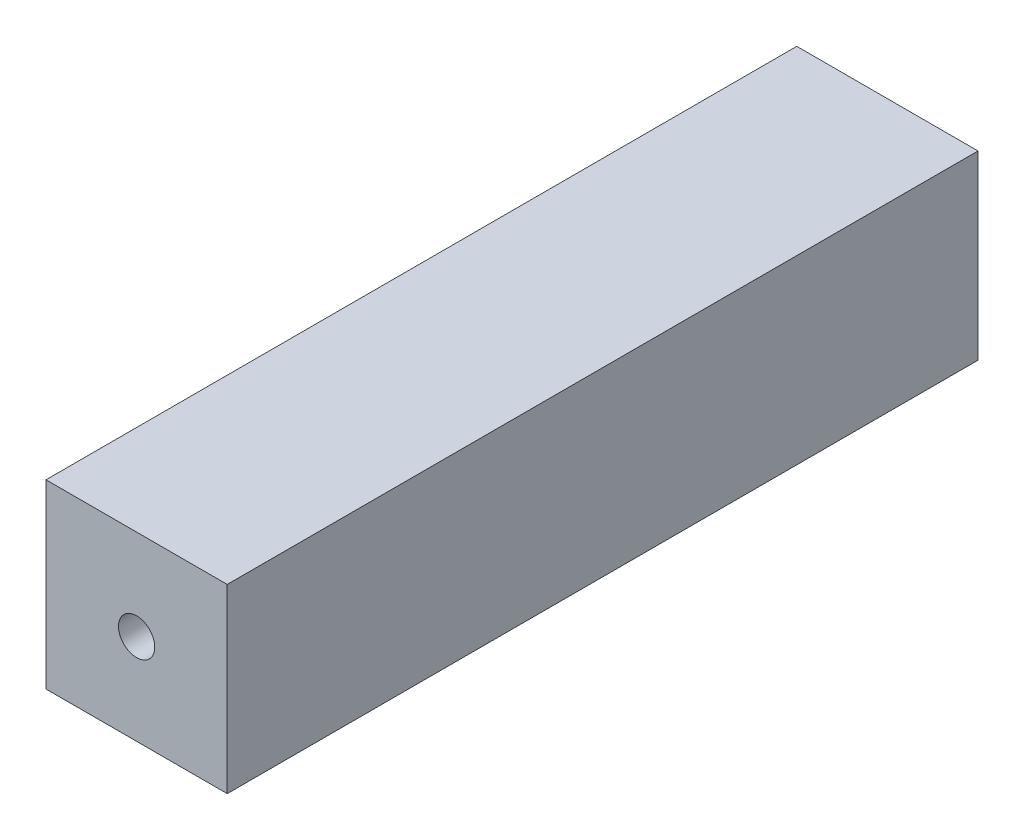
ISO-10303-21;
HEADER;
FILE_DESCRIPTION(('STEP AP214'),'2;1');
FILE_NAME('part.step','',(''),(''),'','','');
FILE_SCHEMA(('AUTOMOTIVE_DESIGN { 1 0 10303 214 1 1 1 1 }'));
ENDSEC;
DATA;
#1=APPLICATION_CONTEXT('core data for automotive mechanical design processes');
#2=APPLICATION_PROTOCOL_DEFINITION('international standard','automotive_design',2000,#1);
#3=PRODUCT_CONTEXT('',#1,'mechanical');
#4=PRODUCT('Part','Part','',(#3));
#5=PRODUCT_RELATED_PRODUCT_CATEGORY('part','',(#4));
#6=PRODUCT_DEFINITION_FORMATION('','',#4);
#7=PRODUCT_DEFINITION_CONTEXT('part definition',#1,'design');
#8=PRODUCT_DEFINITION('design','',#6,#7);
#9=PRODUCT_DEFINITION_SHAPE('','',#8);
#10=(LENGTH_UNIT() NAMED_UNIT(*) SI_UNIT(.MILLI.,.METRE.));
#11=(NAMED_UNIT(*) PLANE_ANGLE_UNIT() SI_UNIT($,.RADIAN.));
#12=(NAMED_UNIT(*) SI_UNIT($,.STERADIAN.) SOLID_ANGLE_UNIT());
#13=UNCERTAINTY_MEASURE_WITH_UNIT(LENGTH_MEASURE(1.E-05),#10,'distance_accuracy_value','');
#14=(GEOMETRIC_REPRESENTATION_CONTEXT(3) GLOBAL_UNCERTAINTY_ASSIGNED_CONTEXT((#13)) GLOBAL_UNIT_ASSIGNED_CONTEXT((#10,
#11,#12)) REPRESENTATION_CONTEXT('',''));
#15=CARTESIAN_POINT('',(0.,0.,0.));
#16=DIRECTION('',(0.,0.,1.));
#17=DIRECTION('',(1.,0.,0.));
#18=AXIS2_PLACEMENT_3D('',#15,#16,#17);
#19=CARTESIAN_POINT('',(8.,-92.,193.6));
#20=DIRECTION('',(0.,0.,1.));
#21=DIRECTION('',(1.,0.,0.));
#22=AXIS2_PLACEMENT_3D('',#19,#20,#21);
#23=PLANE('',#22);
#24=CARTESIAN_POINT('',(8.,-92.,193.6));
#25=DIRECTION('',(0.,0.,1.));
#26=DIRECTION('',(1.,0.,0.));
#27=AXIS2_PLACEMENT_3D('',#24,#25,#26);
#28=CIRCLE('',#27,1.4);
#29=CARTESIAN_POINT('',(9.4,-92.,193.6));
#30=VERTEX_POINT('',#29);
#31=EDGE_CURVE('E9',#30,#30,#28,.T.);
#32=ORIENTED_EDGE('',*,*,#31,.F.);
#33=EDGE_LOOP('',(#32));
#34=FACE_BOUND('',#33,.T.);
#35=ADVANCED_FACE('F14',(#34),#23,.F.);
#36=CARTESIAN_POINT('',(8.,-92.,231.4));
#37=DIRECTION('',(0.,0.,1.));
#38=DIRECTION('',(1.,0.,0.));
#39=AXIS2_PLACEMENT_3D('',#36,#37,#38);
#40=PLANE('',#39);
#41=CARTESIAN_POINT('',(8.,-92.,231.4));
#42=DIRECTION('',(0.,0.,1.));
#43=DIRECTION('',(1.,0.,0.));
#44=AXIS2_PLACEMENT_3D('',#41,#42,#43);
#45=CIRCLE('',#44,1.4);
#46=CARTESIAN_POINT('',(9.4,-92.,231.4));
#47=VERTEX_POINT('',#46);
#48=EDGE_CURVE('E89',#47,#47,#45,.T.);
#49=ORIENTED_EDGE('',*,*,#48,.T.);
#50=EDGE_LOOP('',(#49));
#51=FACE_BOUND('',#50,.T.);
#52=ADVANCED_FACE('F204',(#51),#40,.T.);
#53=CARTESIAN_POINT('',(8.,-92.,181.4));
#54=DIRECTION('',(0.,0.,1.));
#55=DIRECTION('',(1.,0.,0.));
#56=AXIS2_PLACEMENT_3D('',#53,#54,#55);
#57=CYLINDRICAL_SURFACE('',#56,1.4);
#58=CARTESIAN_POINT('',(8.,-92.,181.5));
#59=DIRECTION('',(0.,0.,1.));
#60=DIRECTION('',(1.,0.,0.));
#61=AXIS2_PLACEMENT_3D('',#58,#59,#60);
#62=CIRCLE('',#61,1.4);
#63=CARTESIAN_POINT('',(9.4,-92.,181.5));
#64=VERTEX_POINT('',#63);
#65=EDGE_CURVE('E91',#64,#64,#62,.T.);
#66=ORIENTED_EDGE('',*,*,#65,.F.);
#67=DIRECTION('',(0.,0.,1.));
#68=VECTOR('',#67,1.);
#69=CARTESIAN_POINT('',(9.4,-92.,181.4));
#70=LINE('',#69,#68);
#71=EDGE_CURVE('E25',#64,#30,#70,.T.);
#72=ORIENTED_EDGE('',*,*,#71,.T.);
#73=ORIENTED_EDGE('',*,*,#31,.T.);
#74=ORIENTED_EDGE('',*,*,#71,.F.);
#75=EDGE_LOOP('',(#66,#72,#73,#74));
#76=FACE_BOUND('',#75,.T.);
#77=ADVANCED_FACE('F199',(#76),#57,.F.);
#78=CARTESIAN_POINT('',(8.,-92.,231.4));
#79=DIRECTION('',(0.,0.,1.));
#80=DIRECTION('',(1.,0.,0.));
#81=AXIS2_PLACEMENT_3D('',#78,#79,#80);
#82=CYLINDRICAL_SURFACE('',#81,1.4);
#83=DIRECTION('',(0.,0.,1.));
#84=VECTOR('',#83,1.);
#85=CARTESIAN_POINT('',(9.4,-92.,231.4));
#86=LINE('',#85,#84);
#87=CARTESIAN_POINT('',(9.4,-92.,239.5));
#88=VERTEX_POINT('',#87);
#89=EDGE_CURVE('E85',#47,#88,#86,.T.);
#90=ORIENTED_EDGE('',*,*,#89,.F.);
#91=ORIENTED_EDGE('',*,*,#48,.F.);
#92=ORIENTED_EDGE('',*,*,#89,.T.);
#93=CARTESIAN_POINT('',(8.,-92.,239.5));
#94=DIRECTION('',(0.,0.,1.));
#95=DIRECTION('',(1.,0.,0.));
#96=AXIS2_PLACEMENT_3D('',#93,#94,#95);
#97=CIRCLE('',#96,1.4);
#98=EDGE_CURVE('E88',#88,#88,#97,.T.);
#99=ORIENTED_EDGE('',*,*,#98,.T.);
#100=EDGE_LOOP('',(#90,#91,#92,#99));
#101=FACE_BOUND('',#100,.T.);
#102=ADVANCED_FACE('F86',(#101),#82,.F.);
#103=CARTESIAN_POINT('',(15.,-99.,181.5));
#104=DIRECTION('',(1.,0.,0.));
#105=DIRECTION('',(0.,1.,0.));
#106=AXIS2_PLACEMENT_3D('',#103,#104,#105);
#107=PLANE('',#106);
#108=DIRECTION('',(0.,0.,1.));
#109=VECTOR('',#108,1.);
#110=CARTESIAN_POINT('',(15.,-99.,181.5));
#111=LINE('',#110,#109);
#112=CARTESIAN_POINT('',(15.,-99.,181.5));
#113=VERTEX_POINT('',#112);
#114=CARTESIAN_POINT('',(15.,-99.,239.5));
#115=VERTEX_POINT('',#114);
#116=EDGE_CURVE('E107',#113,#115,#111,.T.);
#117=ORIENTED_EDGE('',*,*,#116,.F.);
#118=DIRECTION('',(0.,1.,0.));
#119=VECTOR('',#118,1.);
#120=CARTESIAN_POINT('',(15.,-99.,181.5));
#121=LINE('',#120,#119);
#122=CARTESIAN_POINT('',(15.,-85.,181.5));
#123=VERTEX_POINT('',#122);
#124=EDGE_CURVE('E75',#113,#123,#121,.T.);
#125=ORIENTED_EDGE('',*,*,#124,.T.);
#126=DIRECTION('',(0.,0.,1.));
#127=VECTOR('',#126,1.);
#128=CARTESIAN_POINT('',(15.,-85.,181.5));
#129=LINE('',#128,#127);
#130=CARTESIAN_POINT('',(15.,-85.,239.5));
#131=VERTEX_POINT('',#130);
#132=EDGE_CURVE('E128',#123,#131,#129,.T.);
#133=ORIENTED_EDGE('',*,*,#132,.T.);
#134=DIRECTION('',(0.,1.,0.));
#135=VECTOR('',#134,1.);
#136=CARTESIAN_POINT('',(15.,-99.,239.5));
#137=LINE('',#136,#135);
#138=EDGE_CURVE('E18',#115,#131,#137,.T.);
#139=ORIENTED_EDGE('',*,*,#138,.F.);
#140=EDGE_LOOP('',(#117,#125,#133,#139));
#141=FACE_BOUND('',#140,.T.);
#142=ADVANCED_FACE('F16',(#141),#107,.T.);
#143=CARTESIAN_POINT('',(1.,-99.,181.5));
#144=DIRECTION('',(0.,0.,1.));
#145=DIRECTION('',(1.,0.,0.));
#146=AXIS2_PLACEMENT_3D('',#143,#144,#145);
#147=PLANE('',#146);
#148=ORIENTED_EDGE('',*,*,#65,.T.);
#149=EDGE_LOOP('',(#148));
#150=FACE_BOUND('',#149,.T.);
#151=DIRECTION('',(1.,0.,0.));
#152=VECTOR('',#151,1.);
#153=CARTESIAN_POINT('',(1.,-85.,181.5));
#154=LINE('',#153,#152);
#155=CARTESIAN_POINT('',(1.,-85.,181.5));
#156=VERTEX_POINT('',#155);
#157=EDGE_CURVE('E134',#156,#123,#154,.T.);
#158=ORIENTED_EDGE('',*,*,#157,.T.);
#159=ORIENTED_EDGE('',*,*,#124,.F.);
#160=DIRECTION('',(1.,0.,0.));
#161=VECTOR('',#160,1.);
#162=CARTESIAN_POINT('',(1.,-99.,181.5));
#163=LINE('',#162,#161);
#164=CARTESIAN_POINT('',(1.,-99.,181.5));
#165=VERTEX_POINT('',#164);
#166=EDGE_CURVE('E106',#165,#113,#163,.T.);
#167=ORIENTED_EDGE('',*,*,#166,.F.);
#168=DIRECTION('',(0.,1.,0.));
#169=VECTOR('',#168,1.);
#170=CARTESIAN_POINT('',(1.,-99.,181.5));
#171=LINE('',#170,#169);
#172=EDGE_CURVE('E125',#165,#156,#171,.T.);
#173=ORIENTED_EDGE('',*,*,#172,.T.);
#174=EDGE_LOOP('',(#158,#159,#167,#173));
#175=FACE_BOUND('',#174,.T.);
#176=ADVANCED_FACE('F172',(#150,#175),#147,.F.);
#177=CARTESIAN_POINT('',(1.,-85.,181.5));
#178=DIRECTION('',(0.,1.,0.));
#179=DIRECTION('',(1.,0.,0.));
#180=AXIS2_PLACEMENT_3D('',#177,#178,#179);
#181=PLANE('',#180);
#182=ORIENTED_EDGE('',*,*,#157,.F.);
#183=DIRECTION('',(0.,0.,1.));
#184=VECTOR('',#183,1.);
#185=CARTESIAN_POINT('',(1.,-85.,181.5));
#186=LINE('',#185,#184);
#187=CARTESIAN_POINT('',(1.,-85.,239.5));
#188=VERTEX_POINT('',#187);
#189=EDGE_CURVE('E102',#156,#188,#186,.T.);
#190=ORIENTED_EDGE('',*,*,#189,.T.);
#191=DIRECTION('',(1.,0.,0.));
#192=VECTOR('',#191,1.);
#193=CARTESIAN_POINT('',(1.,-85.,239.5));
#194=LINE('',#193,#192);
#195=EDGE_CURVE('E143',#188,#131,#194,.T.);
#196=ORIENTED_EDGE('',*,*,#195,.T.);
#197=ORIENTED_EDGE('',*,*,#132,.F.);
#198=EDGE_LOOP('',(#182,#190,#196,#197));
#199=FACE_BOUND('',#198,.T.);
#200=ADVANCED_FACE('F144',(#199),#181,.T.);
#201=CARTESIAN_POINT('',(1.,-99.,239.5));
#202=DIRECTION('',(0.,0.,1.));
#203=DIRECTION('',(1.,0.,0.));
#204=AXIS2_PLACEMENT_3D('',#201,#202,#203);
#205=PLANE('',#204);
#206=ORIENTED_EDGE('',*,*,#98,.F.);
#207=EDGE_LOOP('',(#206));
#208=FACE_BOUND('',#207,.T.);
#209=DIRECTION('',(0.,1.,0.));
#210=VECTOR('',#209,1.);
#211=CARTESIAN_POINT('',(1.,-99.,239.5));
#212=LINE('',#211,#210);
#213=CARTESIAN_POINT('',(1.,-99.,239.5));
#214=VERTEX_POINT('',#213);
#215=EDGE_CURVE('E130',#214,#188,#212,.T.);
#216=ORIENTED_EDGE('',*,*,#215,.F.);
#217=DIRECTION('',(1.,0.,0.));
#218=VECTOR('',#217,1.);
#219=CARTESIAN_POINT('',(1.,-99.,239.5));
#220=LINE('',#219,#218);
#221=EDGE_CURVE('E104',#214,#115,#220,.T.);
#222=ORIENTED_EDGE('',*,*,#221,.T.);
#223=ORIENTED_EDGE('',*,*,#138,.T.);
#224=ORIENTED_EDGE('',*,*,#195,.F.);
#225=EDGE_LOOP('',(#216,#222,#223,#224));
#226=FACE_BOUND('',#225,.T.);
#227=ADVANCED_FACE('F148',(#208,#226),#205,.T.);
#228=CARTESIAN_POINT('',(1.,-99.,181.5));
#229=DIRECTION('',(0.,1.,0.));
#230=DIRECTION('',(1.,0.,0.));
#231=AXIS2_PLACEMENT_3D('',#228,#229,#230);
#232=PLANE('',#231);
#233=ORIENTED_EDGE('',*,*,#116,.T.);
#234=ORIENTED_EDGE('',*,*,#221,.F.);
#235=DIRECTION('',(0.,0.,1.));
#236=VECTOR('',#235,1.);
#237=CARTESIAN_POINT('',(1.,-99.,181.5));
#238=LINE('',#237,#236);
#239=EDGE_CURVE('E118',#165,#214,#238,.T.);
#240=ORIENTED_EDGE('',*,*,#239,.F.);
#241=ORIENTED_EDGE('',*,*,#166,.T.);
#242=EDGE_LOOP('',(#233,#234,#240,#241));
#243=FACE_BOUND('',#242,.T.);
#244=ADVANCED_FACE('F158',(#243),#232,.F.);
#245=CARTESIAN_POINT('',(1.,-99.,181.5));
#246=DIRECTION('',(1.,0.,0.));
#247=DIRECTION('',(0.,1.,0.));
#248=AXIS2_PLACEMENT_3D('',#245,#246,#247);
#249=PLANE('',#248);
#250=ORIENTED_EDGE('',*,*,#215,.T.);
#251=ORIENTED_EDGE('',*,*,#189,.F.);
#252=ORIENTED_EDGE('',*,*,#172,.F.);
#253=ORIENTED_EDGE('',*,*,#239,.T.);
#254=EDGE_LOOP('',(#250,#251,#252,#253));
#255=FACE_BOUND('',#254,.T.);
#256=ADVANCED_FACE('F182',(#255),#249,.F.);
#257=CLOSED_SHELL('',(#35,#52,#77,#102,#142,#176,#200,#227,#244,#256));
#258=MANIFOLD_SOLID_BREP('B1',#257);
#259=ADVANCED_BREP_SHAPE_REPRESENTATION('',(#18,#258),#14);
#260=SHAPE_DEFINITION_REPRESENTATION(#9,#259);
ENDSEC;
END-ISO-10303-21;
